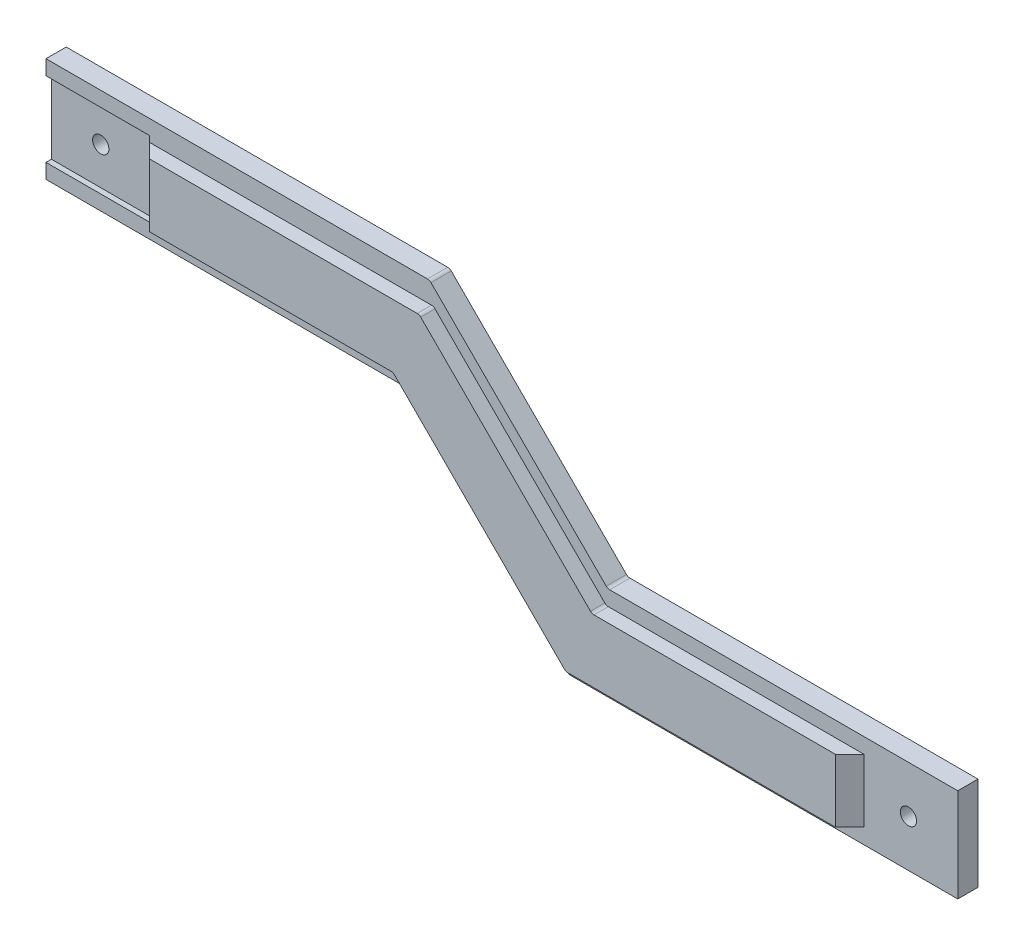
ISO-10303-21;
HEADER;
FILE_DESCRIPTION(('STEP AP214'),'2;1');
FILE_NAME('part.step','',(''),(''),'','','');
FILE_SCHEMA(('AUTOMOTIVE_DESIGN { 1 0 10303 214 1 1 1 1 }'));
ENDSEC;
DATA;
#1=APPLICATION_CONTEXT('core data for automotive mechanical design processes');
#2=APPLICATION_PROTOCOL_DEFINITION('international standard','automotive_design',2000,#1);
#3=PRODUCT_CONTEXT('',#1,'mechanical');
#4=PRODUCT('Part','Part','',(#3));
#5=PRODUCT_RELATED_PRODUCT_CATEGORY('part','',(#4));
#6=PRODUCT_DEFINITION_FORMATION('','',#4);
#7=PRODUCT_DEFINITION_CONTEXT('part definition',#1,'design');
#8=PRODUCT_DEFINITION('design','',#6,#7);
#9=PRODUCT_DEFINITION_SHAPE('','',#8);
#10=(LENGTH_UNIT() NAMED_UNIT(*) SI_UNIT(.MILLI.,.METRE.));
#11=(NAMED_UNIT(*) PLANE_ANGLE_UNIT() SI_UNIT($,.RADIAN.));
#12=(NAMED_UNIT(*) SI_UNIT($,.STERADIAN.) SOLID_ANGLE_UNIT());
#13=UNCERTAINTY_MEASURE_WITH_UNIT(LENGTH_MEASURE(1.E-05),#10,'distance_accuracy_value','');
#14=(GEOMETRIC_REPRESENTATION_CONTEXT(3) GLOBAL_UNCERTAINTY_ASSIGNED_CONTEXT((#13)) GLOBAL_UNIT_ASSIGNED_CONTEXT((#10,
#11,#12)) REPRESENTATION_CONTEXT('',''));
#15=CARTESIAN_POINT('',(0.,0.,0.));
#16=DIRECTION('',(0.,0.,1.));
#17=DIRECTION('',(1.,0.,0.));
#18=AXIS2_PLACEMENT_3D('',#15,#16,#17);
#19=CARTESIAN_POINT('',(-82.4,17.5,3.));
#20=DIRECTION('',(0.,0.,-1.));
#21=DIRECTION('',(-1.,0.,0.));
#22=AXIS2_PLACEMENT_3D('',#19,#20,#21);
#23=CYLINDRICAL_SURFACE('',#22,1.65);
#24=CARTESIAN_POINT('',(-82.4,17.5,-1.1));
#25=DIRECTION('',(0.,0.,1.));
#26=DIRECTION('',(1.,0.,0.));
#27=AXIS2_PLACEMENT_3D('',#24,#25,#26);
#28=CIRCLE('',#27,1.65);
#29=CARTESIAN_POINT('',(-80.75,17.5,-1.1));
#30=VERTEX_POINT('',#29);
#31=EDGE_CURVE('E266',#30,#30,#28,.T.);
#32=ORIENTED_EDGE('',*,*,#31,.F.);
#33=EDGE_LOOP('',(#32));
#34=FACE_BOUND('',#33,.T.);
#35=CARTESIAN_POINT('',(-82.4,17.5,1.9));
#36=DIRECTION('',(0.,0.,1.));
#37=DIRECTION('',(1.,0.,0.));
#38=AXIS2_PLACEMENT_3D('',#35,#36,#37);
#39=CIRCLE('',#38,1.65);
#40=CARTESIAN_POINT('',(-80.75,17.5,1.9));
#41=VERTEX_POINT('',#40);
#42=EDGE_CURVE('E259',#41,#41,#39,.T.);
#43=ORIENTED_EDGE('',*,*,#42,.T.);
#44=EDGE_LOOP('',(#43));
#45=FACE_BOUND('',#44,.T.);
#46=ADVANCED_FACE('F36',(#34,#45),#23,.F.);
#47=CARTESIAN_POINT('',(0.,0.,3.));
#48=DIRECTION('',(0.,0.,-1.));
#49=DIRECTION('',(-1.,0.,0.));
#50=AXIS2_PLACEMENT_3D('',#47,#48,#49);
#51=PLANE('',#50);
#52=CARTESIAN_POINT('',(82.4,-17.5,3.));
#53=DIRECTION('',(0.,0.,1.));
#54=DIRECTION('',(1.,0.,0.));
#55=AXIS2_PLACEMENT_3D('',#52,#53,#54);
#56=CIRCLE('',#55,1.65);
#57=CARTESIAN_POINT('',(84.05,-17.5,3.));
#58=VERTEX_POINT('',#57);
#59=EDGE_CURVE('E318',#58,#58,#56,.T.);
#60=ORIENTED_EDGE('',*,*,#59,.F.);
#61=EDGE_LOOP('',(#60));
#62=FACE_BOUND('',#61,.T.);
#63=DIRECTION('',(-0.707106781186545,0.70710678118655,0.));
#64=VECTOR('',#63,1.);
#65=CARTESIAN_POINT('',(-13.5649711574555,27.,3.));
#66=LINE('',#65,#64);
#67=CARTESIAN_POINT('',(21.142135623731,-7.70710678118669,3.));
#68=VERTEX_POINT('',#67);
#69=CARTESIAN_POINT('',(-14.372077938642,27.8071067811866,3.));
#70=VERTEX_POINT('',#69);
#71=EDGE_CURVE('E354',#68,#70,#66,.T.);
#72=ORIENTED_EDGE('',*,*,#71,.T.);
#73=CARTESIAN_POINT('',(-15.0791847198286,27.1,3.));
#74=DIRECTION('',(0.,0.,-1.));
#75=DIRECTION('',(-1.,0.,0.));
#76=AXIS2_PLACEMENT_3D('',#73,#74,#75);
#77=CIRCLE('',#76,1.);
#78=CARTESIAN_POINT('',(-15.0791847198286,28.1,3.));
#79=VERTEX_POINT('',#78);
#80=EDGE_CURVE('E405',#70,#79,#77,.F.);
#81=ORIENTED_EDGE('',*,*,#80,.T.);
#82=DIRECTION('',(-1.,0.,0.));
#83=VECTOR('',#82,1.);
#84=CARTESIAN_POINT('',(-14.6649711574557,28.1,3.));
#85=LINE('',#84,#83);
#86=CARTESIAN_POINT('',(-92.4,28.1,3.));
#87=VERTEX_POINT('',#86);
#88=EDGE_CURVE('E269',#79,#87,#85,.T.);
#89=ORIENTED_EDGE('',*,*,#88,.T.);
#90=DIRECTION('',(0.,-1.,0.));
#91=VECTOR('',#90,1.);
#92=CARTESIAN_POINT('',(-92.4,8.00000000000001,3.));
#93=LINE('',#92,#91);
#94=CARTESIAN_POINT('',(-92.4,25.1,3.));
#95=VERTEX_POINT('',#94);
#96=EDGE_CURVE('E342',#87,#95,#93,.T.);
#97=ORIENTED_EDGE('',*,*,#96,.T.);
#98=DIRECTION('',(-1.,0.,0.));
#99=VECTOR('',#98,1.);
#100=CARTESIAN_POINT('',(-71.4,25.1,3.));
#101=LINE('',#100,#99);
#102=CARTESIAN_POINT('',(-71.4,25.1,3.));
#103=VERTEX_POINT('',#102);
#104=EDGE_CURVE('E227',#103,#95,#101,.T.);
#105=ORIENTED_EDGE('',*,*,#104,.F.);
#106=DIRECTION('',(0.,1.,0.));
#107=VECTOR('',#106,1.);
#108=CARTESIAN_POINT('',(-71.4,9.90000000000001,3.));
#109=LINE('',#108,#107);
#110=CARTESIAN_POINT('',(-71.4,23.9,3.));
#111=VERTEX_POINT('',#110);
#112=EDGE_CURVE('E255',#111,#103,#109,.T.);
#113=ORIENTED_EDGE('',*,*,#112,.F.);
#114=DIRECTION('',(-1.,0.,0.));
#115=VECTOR('',#114,1.);
#116=CARTESIAN_POINT('',(-13.8490332008122,23.9,3.));
#117=LINE('',#116,#115);
#118=CARTESIAN_POINT('',(-14.2632467631853,23.9,3.));
#119=VERTEX_POINT('',#118);
#120=EDGE_CURVE('E298',#119,#111,#117,.T.);
#121=ORIENTED_EDGE('',*,*,#120,.F.);
#122=CARTESIAN_POINT('',(-14.2632467631853,22.9,3.));
#123=DIRECTION('',(0.,0.,-1.));
#124=DIRECTION('',(-1.,0.,0.));
#125=AXIS2_PLACEMENT_3D('',#122,#123,#124);
#126=CIRCLE('',#125,1.);
#127=CARTESIAN_POINT('',(-13.5561399819987,23.6071067811866,3.));
#128=VERTEX_POINT('',#127);
#129=EDGE_CURVE('E436',#119,#128,#126,.T.);
#130=ORIENTED_EDGE('',*,*,#129,.T.);
#131=DIRECTION('',(-0.707106781186547,0.707106781186547,0.));
#132=VECTOR('',#131,1.);
#133=CARTESIAN_POINT('',(21.1509667991878,-11.1,3.));
#134=LINE('',#133,#132);
#135=CARTESIAN_POINT('',(20.8580735803744,-10.8071067811866,3.));
#136=VERTEX_POINT('',#135);
#137=EDGE_CURVE('E304',#136,#128,#134,.T.);
#138=ORIENTED_EDGE('',*,*,#137,.F.);
#139=CARTESIAN_POINT('',(21.5651803615609,-10.1,3.));
#140=DIRECTION('',(0.,0.,-1.));
#141=DIRECTION('',(-1.,0.,0.));
#142=AXIS2_PLACEMENT_3D('',#139,#140,#141);
#143=CIRCLE('',#142,1.);
#144=CARTESIAN_POINT('',(21.5651803615609,-11.1,3.));
#145=VERTEX_POINT('',#144);
#146=EDGE_CURVE('E403',#136,#145,#143,.F.);
#147=ORIENTED_EDGE('',*,*,#146,.T.);
#148=DIRECTION('',(-1.,0.,0.));
#149=VECTOR('',#148,1.);
#150=CARTESIAN_POINT('',(73.4,-11.1,3.));
#151=LINE('',#150,#149);
#152=CARTESIAN_POINT('',(73.4,-11.1,3.));
#153=VERTEX_POINT('',#152);
#154=EDGE_CURVE('E334',#153,#145,#151,.T.);
#155=ORIENTED_EDGE('',*,*,#154,.F.);
#156=DIRECTION('',(0.,1.,0.));
#157=VECTOR('',#156,1.);
#158=CARTESIAN_POINT('',(73.4,-23.9,3.));
#159=LINE('',#158,#157);
#160=CARTESIAN_POINT('',(73.4,-23.9,3.));
#161=VERTEX_POINT('',#160);
#162=EDGE_CURVE('E331',#161,#153,#159,.T.);
#163=ORIENTED_EDGE('',*,*,#162,.F.);
#164=DIRECTION('',(1.,0.,0.));
#165=VECTOR('',#164,1.);
#166=CARTESIAN_POINT('',(15.8490332008122,-23.9,3.));
#167=LINE('',#166,#165);
#168=CARTESIAN_POINT('',(16.2632467631853,-23.9,3.));
#169=VERTEX_POINT('',#168);
#170=EDGE_CURVE('E329',#169,#161,#167,.T.);
#171=ORIENTED_EDGE('',*,*,#170,.F.);
#172=CARTESIAN_POINT('',(16.2632467631853,-22.9,3.));
#173=DIRECTION('',(0.,0.,-1.));
#174=DIRECTION('',(-1.,0.,0.));
#175=AXIS2_PLACEMENT_3D('',#172,#173,#174);
#176=CIRCLE('',#175,1.);
#177=CARTESIAN_POINT('',(15.5561399819988,-23.6071067811865,3.));
#178=VERTEX_POINT('',#177);
#179=EDGE_CURVE('E444',#169,#178,#176,.T.);
#180=ORIENTED_EDGE('',*,*,#179,.T.);
#181=DIRECTION('',(0.707106781186548,-0.707106781186547,0.));
#182=VECTOR('',#181,1.);
#183=CARTESIAN_POINT('',(-19.1509667991878,11.1,3.));
#184=LINE('',#183,#182);
#185=CARTESIAN_POINT('',(-18.8580735803744,10.8071067811866,3.));
#186=VERTEX_POINT('',#185);
#187=EDGE_CURVE('E326',#186,#178,#184,.T.);
#188=ORIENTED_EDGE('',*,*,#187,.F.);
#189=CARTESIAN_POINT('',(-19.5651803615609,10.1,3.));
#190=DIRECTION('',(0.,0.,-1.));
#191=DIRECTION('',(-1.,0.,0.));
#192=AXIS2_PLACEMENT_3D('',#189,#190,#191);
#193=CIRCLE('',#192,1.);
#194=CARTESIAN_POINT('',(-19.5651803615609,11.1,3.));
#195=VERTEX_POINT('',#194);
#196=EDGE_CURVE('E399',#186,#195,#193,.F.);
#197=ORIENTED_EDGE('',*,*,#196,.T.);
#198=DIRECTION('',(1.,0.,0.));
#199=VECTOR('',#198,1.);
#200=CARTESIAN_POINT('',(-71.4,11.1,3.));
#201=LINE('',#200,#199);
#202=CARTESIAN_POINT('',(-71.4,11.1,3.));
#203=VERTEX_POINT('',#202);
#204=EDGE_CURVE('E323',#203,#195,#201,.T.);
#205=ORIENTED_EDGE('',*,*,#204,.F.);
#206=CARTESIAN_POINT('',(-71.4,9.90000000000001,3.));
#207=VERTEX_POINT('',#206);
#208=EDGE_CURVE('E242',#207,#203,#109,.T.);
#209=ORIENTED_EDGE('',*,*,#208,.F.);
#210=DIRECTION('',(1.,0.,0.));
#211=VECTOR('',#210,1.);
#212=CARTESIAN_POINT('',(-92.4,9.90000000000001,3.));
#213=LINE('',#212,#211);
#214=CARTESIAN_POINT('',(-92.4,9.90000000000001,3.));
#215=VERTEX_POINT('',#214);
#216=EDGE_CURVE('E252',#215,#207,#213,.T.);
#217=ORIENTED_EDGE('',*,*,#216,.F.);
#218=CARTESIAN_POINT('',(-92.4,6.90000000000001,3.));
#219=VERTEX_POINT('',#218);
#220=EDGE_CURVE('E341',#215,#219,#93,.T.);
#221=ORIENTED_EDGE('',*,*,#220,.T.);
#222=DIRECTION('',(1.,0.,0.));
#223=VECTOR('',#222,1.);
#224=CARTESIAN_POINT('',(-92.4,6.90000000000001,3.));
#225=LINE('',#224,#223);
#226=CARTESIAN_POINT('',(-20.7492424049175,6.90000000000001,3.));
#227=VERTEX_POINT('',#226);
#228=EDGE_CURVE('E273',#219,#227,#225,.T.);
#229=ORIENTED_EDGE('',*,*,#228,.T.);
#230=CARTESIAN_POINT('',(-20.7492424049175,5.90000000000001,3.));
#231=DIRECTION('',(0.,0.,-1.));
#232=DIRECTION('',(-1.,0.,0.));
#233=AXIS2_PLACEMENT_3D('',#230,#231,#232);
#234=CIRCLE('',#233,1.);
#235=CARTESIAN_POINT('',(-20.042135623731,6.60710678118657,3.));
#236=VERTEX_POINT('',#235);
#237=EDGE_CURVE('E44',#227,#236,#234,.T.);
#238=ORIENTED_EDGE('',*,*,#237,.T.);
#239=DIRECTION('',(0.707106781186547,-0.707106781186549,0.));
#240=VECTOR('',#239,1.);
#241=CARTESIAN_POINT('',(13.5649711574555,-27.,3.));
#242=LINE('',#241,#240);
#243=CARTESIAN_POINT('',(13.272077938642,-26.7071067811865,3.));
#244=VERTEX_POINT('',#243);
#245=EDGE_CURVE('E344',#236,#244,#242,.T.);
#246=ORIENTED_EDGE('',*,*,#245,.T.);
#247=CARTESIAN_POINT('',(13.9791847198286,-26.,3.));
#248=DIRECTION('',(0.,0.,-1.));
#249=DIRECTION('',(-1.,0.,0.));
#250=AXIS2_PLACEMENT_3D('',#247,#248,#249);
#251=CIRCLE('',#250,1.);
#252=CARTESIAN_POINT('',(13.9791847198286,-27.,3.));
#253=VERTEX_POINT('',#252);
#254=EDGE_CURVE('E401',#244,#253,#251,.F.);
#255=ORIENTED_EDGE('',*,*,#254,.T.);
#256=DIRECTION('',(1.,0.,0.));
#257=VECTOR('',#256,1.);
#258=CARTESIAN_POINT('',(92.4,-27.,3.));
#259=LINE('',#258,#257);
#260=CARTESIAN_POINT('',(92.4,-27.,3.));
#261=VERTEX_POINT('',#260);
#262=EDGE_CURVE('E347',#253,#261,#259,.T.);
#263=ORIENTED_EDGE('',*,*,#262,.T.);
#264=DIRECTION('',(0.,1.,0.));
#265=VECTOR('',#264,1.);
#266=CARTESIAN_POINT('',(92.4,-8.0000000000001,3.));
#267=LINE('',#266,#265);
#268=CARTESIAN_POINT('',(92.4,-8.0000000000001,3.));
#269=VERTEX_POINT('',#268);
#270=EDGE_CURVE('E349',#261,#269,#267,.T.);
#271=ORIENTED_EDGE('',*,*,#270,.T.);
#272=DIRECTION('',(-1.,0.,0.));
#273=VECTOR('',#272,1.);
#274=CARTESIAN_POINT('',(21.4350288425444,-8.00000000000015,3.));
#275=LINE('',#274,#273);
#276=CARTESIAN_POINT('',(21.8492424049175,-8.00000000000015,3.));
#277=VERTEX_POINT('',#276);
#278=EDGE_CURVE('E351',#269,#277,#275,.T.);
#279=ORIENTED_EDGE('',*,*,#278,.T.);
#280=CARTESIAN_POINT('',(21.8492424049175,-7.00000000000014,3.));
#281=DIRECTION('',(0.,0.,-1.));
#282=DIRECTION('',(-1.,0.,0.));
#283=AXIS2_PLACEMENT_3D('',#280,#281,#282);
#284=CIRCLE('',#283,1.);
#285=EDGE_CURVE('E440',#277,#68,#284,.T.);
#286=ORIENTED_EDGE('',*,*,#285,.T.);
#287=EDGE_LOOP('',(#72,#81,#89,#97,#105,#113,#121,#130,#138,#147,#155,#163,#171,#180,#188,#197,
#205,#209,#217,#221,#229,#238,#246,#255,#263,#271,#279,#286));
#288=FACE_BOUND('',#287,.T.);
#289=ADVANCED_FACE('F449',(#62,#288),#51,.F.);
#290=CARTESIAN_POINT('',(-92.4,8.00000000000001,3.));
#291=DIRECTION('',(1.,0.,0.));
#292=DIRECTION('',(0.,0.,-1.));
#293=AXIS2_PLACEMENT_3D('',#290,#291,#292);
#294=PLANE('',#293);
#295=DIRECTION('',(0.,-1.,0.));
#296=VECTOR('',#295,1.);
#297=CARTESIAN_POINT('',(-92.4,25.1,1.9));
#298=LINE('',#297,#296);
#299=CARTESIAN_POINT('',(-92.4,25.1,1.9));
#300=VERTEX_POINT('',#299);
#301=CARTESIAN_POINT('',(-92.4,9.90000000000001,1.9));
#302=VERTEX_POINT('',#301);
#303=EDGE_CURVE('E239',#300,#302,#298,.T.);
#304=ORIENTED_EDGE('',*,*,#303,.F.);
#305=DIRECTION('',(0.,0.,1.));
#306=VECTOR('',#305,1.);
#307=CARTESIAN_POINT('',(-92.4,25.1,1.9));
#308=LINE('',#307,#306);
#309=EDGE_CURVE('E220',#300,#95,#308,.T.);
#310=ORIENTED_EDGE('',*,*,#309,.T.);
#311=ORIENTED_EDGE('',*,*,#96,.F.);
#312=DIRECTION('',(0.,0.,1.));
#313=VECTOR('',#312,1.);
#314=CARTESIAN_POINT('',(-92.4,28.1,-1.1));
#315=LINE('',#314,#313);
#316=CARTESIAN_POINT('',(-92.4,28.1,-1.1));
#317=VERTEX_POINT('',#316);
#318=EDGE_CURVE('E291',#317,#87,#315,.T.);
#319=ORIENTED_EDGE('',*,*,#318,.F.);
#320=DIRECTION('',(0.,-1.,0.));
#321=VECTOR('',#320,1.);
#322=CARTESIAN_POINT('',(-92.4,28.1,-1.1));
#323=LINE('',#322,#321);
#324=CARTESIAN_POINT('',(-92.4,6.90000000000001,-1.1));
#325=VERTEX_POINT('',#324);
#326=EDGE_CURVE('E272',#317,#325,#323,.T.);
#327=ORIENTED_EDGE('',*,*,#326,.T.);
#328=DIRECTION('',(0.,0.,1.));
#329=VECTOR('',#328,1.);
#330=CARTESIAN_POINT('',(-92.4,6.90000000000001,-1.1));
#331=LINE('',#330,#329);
#332=EDGE_CURVE('E295',#325,#219,#331,.T.);
#333=ORIENTED_EDGE('',*,*,#332,.T.);
#334=ORIENTED_EDGE('',*,*,#220,.F.);
#335=DIRECTION('',(0.,0.,1.));
#336=VECTOR('',#335,1.);
#337=CARTESIAN_POINT('',(-92.4,9.90000000000001,1.9));
#338=LINE('',#337,#336);
#339=EDGE_CURVE('E232',#302,#215,#338,.T.);
#340=ORIENTED_EDGE('',*,*,#339,.F.);
#341=EDGE_LOOP('',(#304,#310,#311,#319,#327,#333,#334,#340));
#342=FACE_BOUND('',#341,.T.);
#343=ADVANCED_FACE('F244',(#342),#294,.F.);
#344=CARTESIAN_POINT('',(13.5649711574555,-27.,3.));
#345=DIRECTION('',(0.707106781186548,0.707106781186546,0.));
#346=DIRECTION('',(-0.707106781186547,0.707106781186549,0.));
#347=AXIS2_PLACEMENT_3D('',#344,#345,#346);
#348=PLANE('',#347);
#349=DIRECTION('',(0.707106781186547,-0.707106781186549,0.));
#350=VECTOR('',#349,1.);
#351=CARTESIAN_POINT('',(-20.3350288425444,6.90000000000001,-1.1));
#352=LINE('',#351,#350);
#353=CARTESIAN_POINT('',(-20.042135623731,6.60710678118656,-1.1));
#354=VERTEX_POINT('',#353);
#355=CARTESIAN_POINT('',(13.272077938642,-26.7071067811865,-1.1));
#356=VERTEX_POINT('',#355);
#357=EDGE_CURVE('E278',#354,#356,#352,.T.);
#358=ORIENTED_EDGE('',*,*,#357,.T.);
#359=DIRECTION('',(0.,0.,-1.));
#360=VECTOR('',#359,1.);
#361=CARTESIAN_POINT('',(13.272077938642,-26.7071067811865,3.));
#362=LINE('',#361,#360);
#363=EDGE_CURVE('E421',#356,#244,#362,.F.);
#364=ORIENTED_EDGE('',*,*,#363,.T.);
#365=ORIENTED_EDGE('',*,*,#245,.F.);
#366=DIRECTION('',(0.,0.,1.));
#367=VECTOR('',#366,1.);
#368=CARTESIAN_POINT('',(-20.042135623731,6.60710678118655,3.));
#369=LINE('',#368,#367);
#370=EDGE_CURVE('E419',#236,#354,#369,.F.);
#371=ORIENTED_EDGE('',*,*,#370,.T.);
#372=EDGE_LOOP('',(#358,#364,#365,#371));
#373=FACE_BOUND('',#372,.T.);
#374=ADVANCED_FACE('F456',(#373),#348,.F.);
#375=CARTESIAN_POINT('',(92.4,-27.,3.));
#376=DIRECTION('',(0.,1.,0.));
#377=DIRECTION('',(0.,0.,1.));
#378=AXIS2_PLACEMENT_3D('',#375,#376,#377);
#379=PLANE('',#378);
#380=ORIENTED_EDGE('',*,*,#262,.F.);
#381=DIRECTION('',(0.,0.,-1.));
#382=VECTOR('',#381,1.);
#383=CARTESIAN_POINT('',(13.9791847198286,-27.,3.));
#384=LINE('',#383,#382);
#385=CARTESIAN_POINT('',(13.9791847198286,-27.,-1.1));
#386=VERTEX_POINT('',#385);
#387=EDGE_CURVE('E416',#253,#386,#384,.T.);
#388=ORIENTED_EDGE('',*,*,#387,.T.);
#389=DIRECTION('',(1.,0.,0.));
#390=VECTOR('',#389,1.);
#391=CARTESIAN_POINT('',(13.5649711574555,-27.,-1.1));
#392=LINE('',#391,#390);
#393=CARTESIAN_POINT('',(92.4,-27.,-1.1));
#394=VERTEX_POINT('',#393);
#395=EDGE_CURVE('E280',#386,#394,#392,.T.);
#396=ORIENTED_EDGE('',*,*,#395,.T.);
#397=DIRECTION('',(0.,0.,-1.));
#398=VECTOR('',#397,1.);
#399=CARTESIAN_POINT('',(92.4,-27.,3.));
#400=LINE('',#399,#398);
#401=EDGE_CURVE('E359',#261,#394,#400,.T.);
#402=ORIENTED_EDGE('',*,*,#401,.F.);
#403=EDGE_LOOP('',(#380,#388,#396,#402));
#404=FACE_BOUND('',#403,.T.);
#405=ADVANCED_FACE('F493',(#404),#379,.F.);
#406=CARTESIAN_POINT('',(92.4,-8.0000000000001,3.));
#407=DIRECTION('',(-1.,0.,0.));
#408=DIRECTION('',(0.,0.,1.));
#409=AXIS2_PLACEMENT_3D('',#406,#407,#408);
#410=PLANE('',#409);
#411=ORIENTED_EDGE('',*,*,#401,.T.);
#412=DIRECTION('',(0.,1.,0.));
#413=VECTOR('',#412,1.);
#414=CARTESIAN_POINT('',(92.4,-27.,-1.1));
#415=LINE('',#414,#413);
#416=CARTESIAN_POINT('',(92.4,-8.0000000000001,-1.1));
#417=VERTEX_POINT('',#416);
#418=EDGE_CURVE('E282',#394,#417,#415,.T.);
#419=ORIENTED_EDGE('',*,*,#418,.T.);
#420=DIRECTION('',(0.,0.,-1.));
#421=VECTOR('',#420,1.);
#422=CARTESIAN_POINT('',(92.4,-8.0000000000001,3.));
#423=LINE('',#422,#421);
#424=EDGE_CURVE('E357',#269,#417,#423,.T.);
#425=ORIENTED_EDGE('',*,*,#424,.F.);
#426=ORIENTED_EDGE('',*,*,#270,.F.);
#427=EDGE_LOOP('',(#411,#419,#425,#426));
#428=FACE_BOUND('',#427,.T.);
#429=ADVANCED_FACE('F489',(#428),#410,.F.);
#430=CARTESIAN_POINT('',(21.4350288425444,-8.00000000000015,3.));
#431=DIRECTION('',(0.,-1.,0.));
#432=DIRECTION('',(1.,0.,0.));
#433=AXIS2_PLACEMENT_3D('',#430,#431,#432);
#434=PLANE('',#433);
#435=DIRECTION('',(-1.,0.,0.));
#436=VECTOR('',#435,1.);
#437=CARTESIAN_POINT('',(92.4,-8.0000000000001,-1.1));
#438=LINE('',#437,#436);
#439=CARTESIAN_POINT('',(21.8492424049175,-8.00000000000015,-1.1));
#440=VERTEX_POINT('',#439);
#441=EDGE_CURVE('E285',#417,#440,#438,.T.);
#442=ORIENTED_EDGE('',*,*,#441,.T.);
#443=DIRECTION('',(0.,0.,-1.));
#444=VECTOR('',#443,1.);
#445=CARTESIAN_POINT('',(21.8492424049175,-8.00000000000015,3.));
#446=LINE('',#445,#444);
#447=EDGE_CURVE('E412',#440,#277,#446,.F.);
#448=ORIENTED_EDGE('',*,*,#447,.T.);
#449=ORIENTED_EDGE('',*,*,#278,.F.);
#450=ORIENTED_EDGE('',*,*,#424,.T.);
#451=EDGE_LOOP('',(#442,#448,#449,#450));
#452=FACE_BOUND('',#451,.T.);
#453=ADVANCED_FACE('F485',(#452),#434,.F.);
#454=CARTESIAN_POINT('',(-13.5649711574555,27.,3.));
#455=DIRECTION('',(-0.70710678118655,-0.707106781186545,0.));
#456=DIRECTION('',(0.707106781186545,-0.70710678118655,0.));
#457=AXIS2_PLACEMENT_3D('',#454,#455,#456);
#458=PLANE('',#457);
#459=DIRECTION('',(-0.707106781186548,0.707106781186548,0.));
#460=VECTOR('',#459,1.);
#461=CARTESIAN_POINT('',(21.4350288425444,-8.00000000000015,-1.1));
#462=LINE('',#461,#460);
#463=CARTESIAN_POINT('',(21.142135623731,-7.70710678118669,-1.1));
#464=VERTEX_POINT('',#463);
#465=CARTESIAN_POINT('',(-14.3720779386421,27.8071067811864,-1.1));
#466=VERTEX_POINT('',#465);
#467=EDGE_CURVE('E288',#464,#466,#462,.T.);
#468=ORIENTED_EDGE('',*,*,#467,.T.);
#469=DIRECTION('',(0.,0.,1.));
#470=VECTOR('',#469,1.);
#471=CARTESIAN_POINT('',(-14.372077938642,27.8071067811866,3.));
#472=LINE('',#471,#470);
#473=EDGE_CURVE('E396',#466,#70,#472,.T.);
#474=ORIENTED_EDGE('',*,*,#473,.T.);
#475=ORIENTED_EDGE('',*,*,#71,.F.);
#476=DIRECTION('',(0.,0.,-1.));
#477=VECTOR('',#476,1.);
#478=CARTESIAN_POINT('',(21.142135623731,-7.70710678118669,-1.1));
#479=LINE('',#478,#477);
#480=EDGE_CURVE('E393',#68,#464,#479,.T.);
#481=ORIENTED_EDGE('',*,*,#480,.T.);
#482=EDGE_LOOP('',(#468,#474,#475,#481));
#483=FACE_BOUND('',#482,.T.);
#484=ADVANCED_FACE('F475',(#483),#458,.F.);
#485=CARTESIAN_POINT('',(82.4,-17.5,3.));
#486=DIRECTION('',(0.,0.,-1.));
#487=DIRECTION('',(-1.,0.,0.));
#488=AXIS2_PLACEMENT_3D('',#485,#486,#487);
#489=CYLINDRICAL_SURFACE('',#488,1.65);
#490=ORIENTED_EDGE('',*,*,#59,.T.);
#491=EDGE_LOOP('',(#490));
#492=FACE_BOUND('',#491,.T.);
#493=CARTESIAN_POINT('',(82.4,-17.5,-1.1));
#494=DIRECTION('',(0.,0.,1.));
#495=DIRECTION('',(1.,0.,0.));
#496=AXIS2_PLACEMENT_3D('',#493,#494,#495);
#497=CIRCLE('',#496,1.65);
#498=CARTESIAN_POINT('',(84.05,-17.5,-1.1));
#499=VERTEX_POINT('',#498);
#500=EDGE_CURVE('E263',#499,#499,#497,.T.);
#501=ORIENTED_EDGE('',*,*,#500,.F.);
#502=EDGE_LOOP('',(#501));
#503=FACE_BOUND('',#502,.T.);
#504=ADVANCED_FACE('F521',(#492,#503),#489,.F.);
#505=CARTESIAN_POINT('',(-13.8490332008122,23.9,5.9));
#506=DIRECTION('',(0.,-1.,0.));
#507=DIRECTION('',(0.,0.,-1.));
#508=AXIS2_PLACEMENT_3D('',#505,#506,#507);
#509=PLANE('',#508);
#510=DIRECTION('',(-1.,0.,0.));
#511=VECTOR('',#510,1.);
#512=CARTESIAN_POINT('',(-13.8490332008122,23.9,5.9));
#513=LINE('',#512,#511);
#514=CARTESIAN_POINT('',(-14.2632467631853,23.9,5.9));
#515=VERTEX_POINT('',#514);
#516=CARTESIAN_POINT('',(-68.5,23.9,5.9));
#517=VERTEX_POINT('',#516);
#518=EDGE_CURVE('E301',#515,#517,#513,.T.);
#519=ORIENTED_EDGE('',*,*,#518,.F.);
#520=DIRECTION('',(0.,0.,-1.));
#521=VECTOR('',#520,1.);
#522=CARTESIAN_POINT('',(-14.2632467631853,23.9,5.9));
#523=LINE('',#522,#521);
#524=EDGE_CURVE('E379',#515,#119,#523,.T.);
#525=ORIENTED_EDGE('',*,*,#524,.T.);
#526=ORIENTED_EDGE('',*,*,#120,.T.);
#527=DIRECTION('',(0.707106781186544,0.,0.707106781186551));
#528=VECTOR('',#527,1.);
#529=CARTESIAN_POINT('',(-68.5,23.9,5.9));
#530=LINE('',#529,#528);
#531=EDGE_CURVE('E376',#111,#517,#530,.T.);
#532=ORIENTED_EDGE('',*,*,#531,.T.);
#533=EDGE_LOOP('',(#519,#525,#526,#532));
#534=FACE_BOUND('',#533,.T.);
#535=ADVANCED_FACE('F630',(#534),#509,.F.);
#536=CARTESIAN_POINT('',(-71.4,11.1,5.9));
#537=DIRECTION('',(0.,1.,0.));
#538=DIRECTION('',(0.,0.,1.));
#539=AXIS2_PLACEMENT_3D('',#536,#537,#538);
#540=PLANE('',#539);
#541=ORIENTED_EDGE('',*,*,#204,.T.);
#542=DIRECTION('',(0.,0.,-1.));
#543=VECTOR('',#542,1.);
#544=CARTESIAN_POINT('',(-19.5651803615609,11.1,5.9));
#545=LINE('',#544,#543);
#546=CARTESIAN_POINT('',(-19.5651803615609,11.1,5.9));
#547=VERTEX_POINT('',#546);
#548=EDGE_CURVE('E431',#195,#547,#545,.F.);
#549=ORIENTED_EDGE('',*,*,#548,.T.);
#550=DIRECTION('',(1.,0.,0.));
#551=VECTOR('',#550,1.);
#552=CARTESIAN_POINT('',(-71.4,11.1,5.9));
#553=LINE('',#552,#551);
#554=CARTESIAN_POINT('',(-68.5,11.1,5.9));
#555=VERTEX_POINT('',#554);
#556=EDGE_CURVE('E303',#555,#547,#553,.T.);
#557=ORIENTED_EDGE('',*,*,#556,.F.);
#558=DIRECTION('',(-0.707106781186544,0.,-0.707106781186551));
#559=VECTOR('',#558,1.);
#560=CARTESIAN_POINT('',(-68.5,11.1,5.9));
#561=LINE('',#560,#559);
#562=EDGE_CURVE('E373',#555,#203,#561,.T.);
#563=ORIENTED_EDGE('',*,*,#562,.T.);
#564=EDGE_LOOP('',(#541,#549,#557,#563));
#565=FACE_BOUND('',#564,.T.);
#566=ADVANCED_FACE('F636',(#565),#540,.F.);
#567=CARTESIAN_POINT('',(-19.1509667991878,11.1,5.9));
#568=DIRECTION('',(0.707106781186547,0.707106781186548,0.));
#569=DIRECTION('',(-0.707106781186548,0.707106781186547,0.));
#570=AXIS2_PLACEMENT_3D('',#567,#568,#569);
#571=PLANE('',#570);
#572=ORIENTED_EDGE('',*,*,#187,.T.);
#573=DIRECTION('',(0.,0.,-1.));
#574=VECTOR('',#573,1.);
#575=CARTESIAN_POINT('',(15.5561399819988,-23.6071067811865,5.9));
#576=LINE('',#575,#574);
#577=CARTESIAN_POINT('',(15.5561399819988,-23.6071067811865,5.9));
#578=VERTEX_POINT('',#577);
#579=EDGE_CURVE('E429',#178,#578,#576,.F.);
#580=ORIENTED_EDGE('',*,*,#579,.T.);
#581=DIRECTION('',(0.707106781186548,-0.707106781186547,0.));
#582=VECTOR('',#581,1.);
#583=CARTESIAN_POINT('',(-19.1509667991878,11.1,5.9));
#584=LINE('',#583,#582);
#585=CARTESIAN_POINT('',(-18.8580735803744,10.8071067811866,5.9));
#586=VERTEX_POINT('',#585);
#587=EDGE_CURVE('E307',#586,#578,#584,.T.);
#588=ORIENTED_EDGE('',*,*,#587,.F.);
#589=DIRECTION('',(0.,0.,-1.));
#590=VECTOR('',#589,1.);
#591=CARTESIAN_POINT('',(-18.8580735803744,10.8071067811866,3.));
#592=LINE('',#591,#590);
#593=EDGE_CURVE('E426',#586,#186,#592,.T.);
#594=ORIENTED_EDGE('',*,*,#593,.T.);
#595=EDGE_LOOP('',(#572,#580,#588,#594));
#596=FACE_BOUND('',#595,.T.);
#597=ADVANCED_FACE('F603',(#596),#571,.F.);
#598=CARTESIAN_POINT('',(15.8490332008122,-23.9,5.9));
#599=DIRECTION('',(0.,1.,0.));
#600=DIRECTION('',(0.,0.,1.));
#601=AXIS2_PLACEMENT_3D('',#598,#599,#600);
#602=PLANE('',#601);
#603=DIRECTION('',(1.,0.,0.));
#604=VECTOR('',#603,1.);
#605=CARTESIAN_POINT('',(15.8490332008122,-23.9,5.9));
#606=LINE('',#605,#604);
#607=CARTESIAN_POINT('',(16.2632467631853,-23.9,5.9));
#608=VERTEX_POINT('',#607);
#609=CARTESIAN_POINT('',(70.5,-23.9,5.9));
#610=VERTEX_POINT('',#609);
#611=EDGE_CURVE('E310',#608,#610,#606,.T.);
#612=ORIENTED_EDGE('',*,*,#611,.F.);
#613=DIRECTION('',(0.,0.,-1.));
#614=VECTOR('',#613,1.);
#615=CARTESIAN_POINT('',(16.2632467631853,-23.9,5.9));
#616=LINE('',#615,#614);
#617=EDGE_CURVE('E423',#608,#169,#616,.T.);
#618=ORIENTED_EDGE('',*,*,#617,.T.);
#619=ORIENTED_EDGE('',*,*,#170,.T.);
#620=DIRECTION('',(-0.707106781186544,0.,0.707106781186551));
#621=VECTOR('',#620,1.);
#622=CARTESIAN_POINT('',(70.5,-23.9,5.9));
#623=LINE('',#622,#621);
#624=EDGE_CURVE('E370',#161,#610,#623,.T.);
#625=ORIENTED_EDGE('',*,*,#624,.T.);
#626=EDGE_LOOP('',(#612,#618,#619,#625));
#627=FACE_BOUND('',#626,.T.);
#628=ADVANCED_FACE('F609',(#627),#602,.F.);
#629=CARTESIAN_POINT('',(73.4,-11.1,5.9));
#630=DIRECTION('',(0.,-1.,0.));
#631=DIRECTION('',(1.,0.,0.));
#632=AXIS2_PLACEMENT_3D('',#629,#630,#631);
#633=PLANE('',#632);
#634=ORIENTED_EDGE('',*,*,#154,.T.);
#635=DIRECTION('',(0.,0.,-1.));
#636=VECTOR('',#635,1.);
#637=CARTESIAN_POINT('',(21.5651803615609,-11.1,5.9));
#638=LINE('',#637,#636);
#639=CARTESIAN_POINT('',(21.5651803615609,-11.1,5.9));
#640=VERTEX_POINT('',#639);
#641=EDGE_CURVE('E414',#145,#640,#638,.F.);
#642=ORIENTED_EDGE('',*,*,#641,.T.);
#643=DIRECTION('',(-1.,0.,0.));
#644=VECTOR('',#643,1.);
#645=CARTESIAN_POINT('',(73.4,-11.1,5.9));
#646=LINE('',#645,#644);
#647=CARTESIAN_POINT('',(70.5,-11.1,5.9));
#648=VERTEX_POINT('',#647);
#649=EDGE_CURVE('E312',#648,#640,#646,.T.);
#650=ORIENTED_EDGE('',*,*,#649,.F.);
#651=DIRECTION('',(0.707106781186544,0.,-0.707106781186551));
#652=VECTOR('',#651,1.);
#653=CARTESIAN_POINT('',(70.5,-11.1,5.9));
#654=LINE('',#653,#652);
#655=EDGE_CURVE('E368',#648,#153,#654,.T.);
#656=ORIENTED_EDGE('',*,*,#655,.T.);
#657=EDGE_LOOP('',(#634,#642,#650,#656));
#658=FACE_BOUND('',#657,.T.);
#659=ADVANCED_FACE('F617',(#658),#633,.F.);
#660=CARTESIAN_POINT('',(21.1509667991878,-11.1,5.9));
#661=DIRECTION('',(-0.707106781186548,-0.707106781186548,0.));
#662=DIRECTION('',(0.707106781186548,-0.707106781186548,0.));
#663=AXIS2_PLACEMENT_3D('',#660,#661,#662);
#664=PLANE('',#663);
#665=ORIENTED_EDGE('',*,*,#137,.T.);
#666=DIRECTION('',(0.,0.,-1.));
#667=VECTOR('',#666,1.);
#668=CARTESIAN_POINT('',(-13.5561399819987,23.6071067811866,5.9));
#669=LINE('',#668,#667);
#670=CARTESIAN_POINT('',(-13.5561399819987,23.6071067811866,5.9));
#671=VERTEX_POINT('',#670);
#672=EDGE_CURVE('E387',#128,#671,#669,.F.);
#673=ORIENTED_EDGE('',*,*,#672,.T.);
#674=DIRECTION('',(-0.707106781186547,0.707106781186547,0.));
#675=VECTOR('',#674,1.);
#676=CARTESIAN_POINT('',(21.1509667991878,-11.1,5.9));
#677=LINE('',#676,#675);
#678=CARTESIAN_POINT('',(20.8580735803744,-10.8071067811866,5.9));
#679=VERTEX_POINT('',#678);
#680=EDGE_CURVE('E315',#679,#671,#677,.T.);
#681=ORIENTED_EDGE('',*,*,#680,.F.);
#682=DIRECTION('',(0.,0.,-1.));
#683=VECTOR('',#682,1.);
#684=CARTESIAN_POINT('',(20.8580735803744,-10.8071067811866,3.));
#685=LINE('',#684,#683);
#686=EDGE_CURVE('E384',#679,#136,#685,.T.);
#687=ORIENTED_EDGE('',*,*,#686,.T.);
#688=EDGE_LOOP('',(#665,#673,#681,#687));
#689=FACE_BOUND('',#688,.T.);
#690=ADVANCED_FACE('F624',(#689),#664,.F.);
#691=CARTESIAN_POINT('',(0.,0.,5.9));
#692=DIRECTION('',(0.,0.,1.));
#693=DIRECTION('',(1.,0.,0.));
#694=AXIS2_PLACEMENT_3D('',#691,#692,#693);
#695=PLANE('',#694);
#696=ORIENTED_EDGE('',*,*,#680,.T.);
#697=CARTESIAN_POINT('',(-14.2632467631853,22.9,5.9));
#698=DIRECTION('',(0.,0.,1.));
#699=DIRECTION('',(1.,0.,0.));
#700=AXIS2_PLACEMENT_3D('',#697,#698,#699);
#701=CIRCLE('',#700,1.);
#702=EDGE_CURVE('E391',#671,#515,#701,.T.);
#703=ORIENTED_EDGE('',*,*,#702,.T.);
#704=ORIENTED_EDGE('',*,*,#518,.T.);
#705=DIRECTION('',(0.,-1.,0.));
#706=VECTOR('',#705,1.);
#707=CARTESIAN_POINT('',(-68.5,11.1,5.9));
#708=LINE('',#707,#706);
#709=EDGE_CURVE('E362',#517,#555,#708,.T.);
#710=ORIENTED_EDGE('',*,*,#709,.T.);
#711=ORIENTED_EDGE('',*,*,#556,.T.);
#712=CARTESIAN_POINT('',(-19.5651803615609,10.1,5.9));
#713=DIRECTION('',(0.,0.,1.));
#714=DIRECTION('',(1.,0.,0.));
#715=AXIS2_PLACEMENT_3D('',#712,#713,#714);
#716=CIRCLE('',#715,1.);
#717=EDGE_CURVE('E446',#547,#586,#716,.F.);
#718=ORIENTED_EDGE('',*,*,#717,.T.);
#719=ORIENTED_EDGE('',*,*,#587,.T.);
#720=CARTESIAN_POINT('',(16.2632467631853,-22.9,5.9));
#721=DIRECTION('',(0.,0.,1.));
#722=DIRECTION('',(1.,0.,0.));
#723=AXIS2_PLACEMENT_3D('',#720,#721,#722);
#724=CIRCLE('',#723,1.);
#725=EDGE_CURVE('E389',#578,#608,#724,.T.);
#726=ORIENTED_EDGE('',*,*,#725,.T.);
#727=ORIENTED_EDGE('',*,*,#611,.T.);
#728=DIRECTION('',(0.,1.,0.));
#729=VECTOR('',#728,1.);
#730=CARTESIAN_POINT('',(70.5,-11.1,5.9));
#731=LINE('',#730,#729);
#732=EDGE_CURVE('E365',#610,#648,#731,.T.);
#733=ORIENTED_EDGE('',*,*,#732,.T.);
#734=ORIENTED_EDGE('',*,*,#649,.T.);
#735=CARTESIAN_POINT('',(21.5651803615609,-10.1,5.9));
#736=DIRECTION('',(0.,0.,1.));
#737=DIRECTION('',(1.,0.,0.));
#738=AXIS2_PLACEMENT_3D('',#735,#736,#737);
#739=CIRCLE('',#738,1.);
#740=EDGE_CURVE('E442',#640,#679,#739,.F.);
#741=ORIENTED_EDGE('',*,*,#740,.T.);
#742=EDGE_LOOP('',(#696,#703,#704,#710,#711,#718,#719,#726,#727,#733,#734,#741));
#743=FACE_BOUND('',#742,.T.);
#744=ADVANCED_FACE('F544',(#743),#695,.T.);
#745=CARTESIAN_POINT('',(70.5,0.,5.9));
#746=DIRECTION('',(0.707106781186551,0.,0.707106781186544));
#747=DIRECTION('',(0.,-1.,0.));
#748=AXIS2_PLACEMENT_3D('',#745,#746,#747);
#749=PLANE('',#748);
#750=ORIENTED_EDGE('',*,*,#624,.F.);
#751=ORIENTED_EDGE('',*,*,#162,.T.);
#752=ORIENTED_EDGE('',*,*,#655,.F.);
#753=ORIENTED_EDGE('',*,*,#732,.F.);
#754=EDGE_LOOP('',(#750,#751,#752,#753));
#755=FACE_BOUND('',#754,.T.);
#756=ADVANCED_FACE('F537',(#755),#749,.T.);
#757=CARTESIAN_POINT('',(-68.5,0.,5.9));
#758=DIRECTION('',(-0.707106781186551,0.,0.707106781186544));
#759=DIRECTION('',(0.,1.,0.));
#760=AXIS2_PLACEMENT_3D('',#757,#758,#759);
#761=PLANE('',#760);
#762=ORIENTED_EDGE('',*,*,#531,.F.);
#763=DIRECTION('',(0.,-1.,0.));
#764=VECTOR('',#763,1.);
#765=CARTESIAN_POINT('',(-71.4,23.9,3.));
#766=LINE('',#765,#764);
#767=EDGE_CURVE('E320',#111,#203,#766,.T.);
#768=ORIENTED_EDGE('',*,*,#767,.T.);
#769=ORIENTED_EDGE('',*,*,#562,.F.);
#770=ORIENTED_EDGE('',*,*,#709,.F.);
#771=EDGE_LOOP('',(#762,#768,#769,#770));
#772=FACE_BOUND('',#771,.T.);
#773=ADVANCED_FACE('F543',(#772),#761,.T.);
#774=CARTESIAN_POINT('',(-14.6649711574557,28.1,-1.1));
#775=DIRECTION('',(0.,1.,0.));
#776=DIRECTION('',(-1.,0.,0.));
#777=AXIS2_PLACEMENT_3D('',#774,#775,#776);
#778=PLANE('',#777);
#779=ORIENTED_EDGE('',*,*,#88,.F.);
#780=DIRECTION('',(0.,0.,1.));
#781=VECTOR('',#780,1.);
#782=CARTESIAN_POINT('',(-15.0791847198286,28.1,-1.1));
#783=LINE('',#782,#781);
#784=CARTESIAN_POINT('',(-15.0791847198286,28.1,-1.1));
#785=VERTEX_POINT('',#784);
#786=EDGE_CURVE('E407',#79,#785,#783,.F.);
#787=ORIENTED_EDGE('',*,*,#786,.T.);
#788=DIRECTION('',(-1.,0.,0.));
#789=VECTOR('',#788,1.);
#790=CARTESIAN_POINT('',(-14.6649711574557,28.1,-1.1));
#791=LINE('',#790,#789);
#792=EDGE_CURVE('E270',#785,#317,#791,.T.);
#793=ORIENTED_EDGE('',*,*,#792,.T.);
#794=ORIENTED_EDGE('',*,*,#318,.T.);
#795=EDGE_LOOP('',(#779,#787,#793,#794));
#796=FACE_BOUND('',#795,.T.);
#797=ADVANCED_FACE('F466',(#796),#778,.T.);
#798=CARTESIAN_POINT('',(-92.4,6.90000000000001,-1.1));
#799=DIRECTION('',(0.,-1.,0.));
#800=DIRECTION('',(0.,0.,-1.));
#801=AXIS2_PLACEMENT_3D('',#798,#799,#800);
#802=PLANE('',#801);
#803=DIRECTION('',(1.,0.,0.));
#804=VECTOR('',#803,1.);
#805=CARTESIAN_POINT('',(-92.4,6.90000000000001,-1.1));
#806=LINE('',#805,#804);
#807=CARTESIAN_POINT('',(-20.7492424049175,6.90000000000001,-1.1));
#808=VERTEX_POINT('',#807);
#809=EDGE_CURVE('E276',#325,#808,#806,.T.);
#810=ORIENTED_EDGE('',*,*,#809,.T.);
#811=DIRECTION('',(0.,0.,1.));
#812=VECTOR('',#811,1.);
#813=CARTESIAN_POINT('',(-20.7492424049175,6.90000000000001,-1.1));
#814=LINE('',#813,#812);
#815=EDGE_CURVE('E433',#808,#227,#814,.T.);
#816=ORIENTED_EDGE('',*,*,#815,.T.);
#817=ORIENTED_EDGE('',*,*,#228,.F.);
#818=ORIENTED_EDGE('',*,*,#332,.F.);
#819=EDGE_LOOP('',(#810,#816,#817,#818));
#820=FACE_BOUND('',#819,.T.);
#821=ADVANCED_FACE('F459',(#820),#802,.T.);
#822=CARTESIAN_POINT('',(0.,0.,-1.1));
#823=DIRECTION('',(0.,0.,1.));
#824=DIRECTION('',(1.,0.,0.));
#825=AXIS2_PLACEMENT_3D('',#822,#823,#824);
#826=PLANE('',#825);
#827=ORIENTED_EDGE('',*,*,#500,.T.);
#828=EDGE_LOOP('',(#827));
#829=FACE_BOUND('',#828,.T.);
#830=ORIENTED_EDGE('',*,*,#31,.T.);
#831=EDGE_LOOP('',(#830));
#832=FACE_BOUND('',#831,.T.);
#833=ORIENTED_EDGE('',*,*,#792,.F.);
#834=CARTESIAN_POINT('',(-15.0791847198286,27.1,-1.1));
#835=DIRECTION('',(0.,0.,1.));
#836=DIRECTION('',(1.,0.,0.));
#837=AXIS2_PLACEMENT_3D('',#834,#835,#836);
#838=CIRCLE('',#837,1.);
#839=EDGE_CURVE('E410',#785,#466,#838,.F.);
#840=ORIENTED_EDGE('',*,*,#839,.T.);
#841=ORIENTED_EDGE('',*,*,#467,.F.);
#842=CARTESIAN_POINT('',(21.8492424049175,-7.00000000000014,-1.1));
#843=DIRECTION('',(0.,0.,1.));
#844=DIRECTION('',(1.,0.,0.));
#845=AXIS2_PLACEMENT_3D('',#842,#843,#844);
#846=CIRCLE('',#845,1.);
#847=EDGE_CURVE('E438',#464,#440,#846,.T.);
#848=ORIENTED_EDGE('',*,*,#847,.T.);
#849=ORIENTED_EDGE('',*,*,#441,.F.);
#850=ORIENTED_EDGE('',*,*,#418,.F.);
#851=ORIENTED_EDGE('',*,*,#395,.F.);
#852=CARTESIAN_POINT('',(13.9791847198286,-26.,-1.1));
#853=DIRECTION('',(0.,0.,1.));
#854=DIRECTION('',(1.,0.,0.));
#855=AXIS2_PLACEMENT_3D('',#852,#853,#854);
#856=CIRCLE('',#855,1.);
#857=EDGE_CURVE('E55',#386,#356,#856,.F.);
#858=ORIENTED_EDGE('',*,*,#857,.T.);
#859=ORIENTED_EDGE('',*,*,#357,.F.);
#860=CARTESIAN_POINT('',(-20.7492424049175,5.90000000000001,-1.1));
#861=DIRECTION('',(0.,0.,1.));
#862=DIRECTION('',(1.,0.,0.));
#863=AXIS2_PLACEMENT_3D('',#860,#861,#862);
#864=CIRCLE('',#863,1.);
#865=EDGE_CURVE('E11',#354,#808,#864,.T.);
#866=ORIENTED_EDGE('',*,*,#865,.T.);
#867=ORIENTED_EDGE('',*,*,#809,.F.);
#868=ORIENTED_EDGE('',*,*,#326,.F.);
#869=EDGE_LOOP('',(#833,#840,#841,#848,#849,#850,#851,#858,#859,#866,#867,#868));
#870=FACE_BOUND('',#869,.T.);
#871=ADVANCED_FACE('F462',(#829,#832,#870),#826,.F.);
#872=CARTESIAN_POINT('',(-71.4,25.1,1.9));
#873=DIRECTION('',(0.,1.,0.));
#874=DIRECTION('',(-1.,0.,0.));
#875=AXIS2_PLACEMENT_3D('',#872,#873,#874);
#876=PLANE('',#875);
#877=ORIENTED_EDGE('',*,*,#104,.T.);
#878=ORIENTED_EDGE('',*,*,#309,.F.);
#879=DIRECTION('',(-1.,0.,0.));
#880=VECTOR('',#879,1.);
#881=CARTESIAN_POINT('',(-71.4,25.1,1.9));
#882=LINE('',#881,#880);
#883=CARTESIAN_POINT('',(-71.4,25.1,1.9));
#884=VERTEX_POINT('',#883);
#885=EDGE_CURVE('E224',#884,#300,#882,.T.);
#886=ORIENTED_EDGE('',*,*,#885,.F.);
#887=DIRECTION('',(0.,0.,1.));
#888=VECTOR('',#887,1.);
#889=CARTESIAN_POINT('',(-71.4,25.1,1.9));
#890=LINE('',#889,#888);
#891=EDGE_CURVE('E257',#884,#103,#890,.T.);
#892=ORIENTED_EDGE('',*,*,#891,.T.);
#893=EDGE_LOOP('',(#877,#878,#886,#892));
#894=FACE_BOUND('',#893,.T.);
#895=ADVANCED_FACE('F222',(#894),#876,.F.);
#896=CARTESIAN_POINT('',(-71.4,9.90000000000001,1.9));
#897=DIRECTION('',(1.,0.,0.));
#898=DIRECTION('',(0.,0.,-1.));
#899=AXIS2_PLACEMENT_3D('',#896,#897,#898);
#900=PLANE('',#899);
#901=ORIENTED_EDGE('',*,*,#208,.T.);
#902=ORIENTED_EDGE('',*,*,#767,.F.);
#903=ORIENTED_EDGE('',*,*,#112,.T.);
#904=ORIENTED_EDGE('',*,*,#891,.F.);
#905=DIRECTION('',(0.,1.,0.));
#906=VECTOR('',#905,1.);
#907=CARTESIAN_POINT('',(-71.4,9.90000000000001,1.9));
#908=LINE('',#907,#906);
#909=CARTESIAN_POINT('',(-71.4,9.90000000000001,1.9));
#910=VERTEX_POINT('',#909);
#911=EDGE_CURVE('E233',#910,#884,#908,.T.);
#912=ORIENTED_EDGE('',*,*,#911,.F.);
#913=DIRECTION('',(0.,0.,1.));
#914=VECTOR('',#913,1.);
#915=CARTESIAN_POINT('',(-71.4,9.90000000000001,1.9));
#916=LINE('',#915,#914);
#917=EDGE_CURVE('E260',#910,#207,#916,.T.);
#918=ORIENTED_EDGE('',*,*,#917,.T.);
#919=EDGE_LOOP('',(#901,#902,#903,#904,#912,#918));
#920=FACE_BOUND('',#919,.T.);
#921=ADVANCED_FACE('F642',(#920),#900,.F.);
#922=CARTESIAN_POINT('',(-92.4,9.90000000000001,1.9));
#923=DIRECTION('',(0.,-1.,0.));
#924=DIRECTION('',(0.,0.,-1.));
#925=AXIS2_PLACEMENT_3D('',#922,#923,#924);
#926=PLANE('',#925);
#927=ORIENTED_EDGE('',*,*,#216,.T.);
#928=ORIENTED_EDGE('',*,*,#917,.F.);
#929=DIRECTION('',(1.,0.,0.));
#930=VECTOR('',#929,1.);
#931=CARTESIAN_POINT('',(-92.4,9.90000000000001,1.9));
#932=LINE('',#931,#930);
#933=EDGE_CURVE('E246',#302,#910,#932,.T.);
#934=ORIENTED_EDGE('',*,*,#933,.F.);
#935=ORIENTED_EDGE('',*,*,#339,.T.);
#936=EDGE_LOOP('',(#927,#928,#934,#935));
#937=FACE_BOUND('',#936,.T.);
#938=ADVANCED_FACE('F644',(#937),#926,.F.);
#939=CARTESIAN_POINT('',(0.,0.,1.9));
#940=DIRECTION('',(0.,0.,1.));
#941=DIRECTION('',(1.,0.,0.));
#942=AXIS2_PLACEMENT_3D('',#939,#940,#941);
#943=PLANE('',#942);
#944=ORIENTED_EDGE('',*,*,#42,.F.);
#945=EDGE_LOOP('',(#944));
#946=FACE_BOUND('',#945,.T.);
#947=ORIENTED_EDGE('',*,*,#885,.T.);
#948=ORIENTED_EDGE('',*,*,#303,.T.);
#949=ORIENTED_EDGE('',*,*,#933,.T.);
#950=ORIENTED_EDGE('',*,*,#911,.T.);
#951=EDGE_LOOP('',(#947,#948,#949,#950));
#952=FACE_BOUND('',#951,.T.);
#953=ADVANCED_FACE('F237',(#946,#952),#943,.T.);
#954=CARTESIAN_POINT('',(-14.2632467631853,22.9,5.9));
#955=DIRECTION('',(0.,0.,-1.));
#956=DIRECTION('',(-1.,0.,0.));
#957=AXIS2_PLACEMENT_3D('',#954,#955,#956);
#958=CYLINDRICAL_SURFACE('',#957,1.);
#959=ORIENTED_EDGE('',*,*,#702,.F.);
#960=ORIENTED_EDGE('',*,*,#672,.F.);
#961=ORIENTED_EDGE('',*,*,#129,.F.);
#962=ORIENTED_EDGE('',*,*,#524,.F.);
#963=EDGE_LOOP('',(#959,#960,#961,#962));
#964=FACE_BOUND('',#963,.T.);
#965=ADVANCED_FACE('F551',(#964),#958,.T.);
#966=CARTESIAN_POINT('',(-15.0791847198286,27.1,3.));
#967=DIRECTION('',(0.,0.,-1.));
#968=DIRECTION('',(-1.,0.,0.));
#969=AXIS2_PLACEMENT_3D('',#966,#967,#968);
#970=CYLINDRICAL_SURFACE('',#969,1.);
#971=ORIENTED_EDGE('',*,*,#839,.F.);
#972=ORIENTED_EDGE('',*,*,#786,.F.);
#973=ORIENTED_EDGE('',*,*,#80,.F.);
#974=ORIENTED_EDGE('',*,*,#473,.F.);
#975=EDGE_LOOP('',(#971,#972,#973,#974));
#976=FACE_BOUND('',#975,.T.);
#977=ADVANCED_FACE('F472',(#976),#970,.T.);
#978=CARTESIAN_POINT('',(21.8492424049175,-7.00000000000014,3.));
#979=DIRECTION('',(0.,0.,1.));
#980=DIRECTION('',(1.,0.,0.));
#981=AXIS2_PLACEMENT_3D('',#978,#979,#980);
#982=CYLINDRICAL_SURFACE('',#981,1.);
#983=ORIENTED_EDGE('',*,*,#285,.F.);
#984=ORIENTED_EDGE('',*,*,#447,.F.);
#985=ORIENTED_EDGE('',*,*,#847,.F.);
#986=ORIENTED_EDGE('',*,*,#480,.F.);
#987=EDGE_LOOP('',(#983,#984,#985,#986));
#988=FACE_BOUND('',#987,.T.);
#989=ADVANCED_FACE('F481',(#988),#982,.F.);
#990=CARTESIAN_POINT('',(21.5651803615609,-10.1,5.9));
#991=DIRECTION('',(0.,0.,1.));
#992=DIRECTION('',(1.,0.,0.));
#993=AXIS2_PLACEMENT_3D('',#990,#991,#992);
#994=CYLINDRICAL_SURFACE('',#993,1.);
#995=ORIENTED_EDGE('',*,*,#740,.F.);
#996=ORIENTED_EDGE('',*,*,#641,.F.);
#997=ORIENTED_EDGE('',*,*,#146,.F.);
#998=ORIENTED_EDGE('',*,*,#686,.F.);
#999=EDGE_LOOP('',(#995,#996,#997,#998));
#1000=FACE_BOUND('',#999,.T.);
#1001=ADVANCED_FACE('F499',(#1000),#994,.F.);
#1002=CARTESIAN_POINT('',(13.9791847198286,-26.,3.));
#1003=DIRECTION('',(0.,0.,-1.));
#1004=DIRECTION('',(-1.,0.,0.));
#1005=AXIS2_PLACEMENT_3D('',#1002,#1003,#1004);
#1006=CYLINDRICAL_SURFACE('',#1005,1.);
#1007=ORIENTED_EDGE('',*,*,#254,.F.);
#1008=ORIENTED_EDGE('',*,*,#363,.F.);
#1009=ORIENTED_EDGE('',*,*,#857,.F.);
#1010=ORIENTED_EDGE('',*,*,#387,.F.);
#1011=EDGE_LOOP('',(#1007,#1008,#1009,#1010));
#1012=FACE_BOUND('',#1011,.T.);
#1013=ADVANCED_FACE('F496',(#1012),#1006,.T.);
#1014=CARTESIAN_POINT('',(16.2632467631853,-22.9,5.9));
#1015=DIRECTION('',(0.,0.,-1.));
#1016=DIRECTION('',(-1.,0.,0.));
#1017=AXIS2_PLACEMENT_3D('',#1014,#1015,#1016);
#1018=CYLINDRICAL_SURFACE('',#1017,1.);
#1019=ORIENTED_EDGE('',*,*,#725,.F.);
#1020=ORIENTED_EDGE('',*,*,#579,.F.);
#1021=ORIENTED_EDGE('',*,*,#179,.F.);
#1022=ORIENTED_EDGE('',*,*,#617,.F.);
#1023=EDGE_LOOP('',(#1019,#1020,#1021,#1022));
#1024=FACE_BOUND('',#1023,.T.);
#1025=ADVANCED_FACE('F498',(#1024),#1018,.T.);
#1026=CARTESIAN_POINT('',(-19.5651803615609,10.1,5.9));
#1027=DIRECTION('',(0.,0.,1.));
#1028=DIRECTION('',(1.,0.,0.));
#1029=AXIS2_PLACEMENT_3D('',#1026,#1027,#1028);
#1030=CYLINDRICAL_SURFACE('',#1029,1.);
#1031=ORIENTED_EDGE('',*,*,#717,.F.);
#1032=ORIENTED_EDGE('',*,*,#548,.F.);
#1033=ORIENTED_EDGE('',*,*,#196,.F.);
#1034=ORIENTED_EDGE('',*,*,#593,.F.);
#1035=EDGE_LOOP('',(#1031,#1032,#1033,#1034));
#1036=FACE_BOUND('',#1035,.T.);
#1037=ADVANCED_FACE('F505',(#1036),#1030,.F.);
#1038=CARTESIAN_POINT('',(-20.7492424049175,5.90000000000001,-1.1));
#1039=DIRECTION('',(0.,0.,1.));
#1040=DIRECTION('',(1.,0.,0.));
#1041=AXIS2_PLACEMENT_3D('',#1038,#1039,#1040);
#1042=CYLINDRICAL_SURFACE('',#1041,1.);
#1043=ORIENTED_EDGE('',*,*,#865,.F.);
#1044=ORIENTED_EDGE('',*,*,#370,.F.);
#1045=ORIENTED_EDGE('',*,*,#237,.F.);
#1046=ORIENTED_EDGE('',*,*,#815,.F.);
#1047=EDGE_LOOP('',(#1043,#1044,#1045,#1046));
#1048=FACE_BOUND('',#1047,.T.);
#1049=ADVANCED_FACE('F38',(#1048),#1042,.F.);
#1050=CLOSED_SHELL('',(#46,#289,#343,#374,#405,#429,#453,#484,#504,#535,#566,#597,#628,#659,
#690,#744,#756,#773,#797,#821,#871,#895,#921,#938,#953,#965,#977,#989,#1001,#1013,#1025,#1037,#1049));
#1051=MANIFOLD_SOLID_BREP('B2',#1050);
#1052=ADVANCED_BREP_SHAPE_REPRESENTATION('',(#18,#1051),#14);
#1053=SHAPE_DEFINITION_REPRESENTATION(#9,#1052);
ENDSEC;
END-ISO-10303-21;
